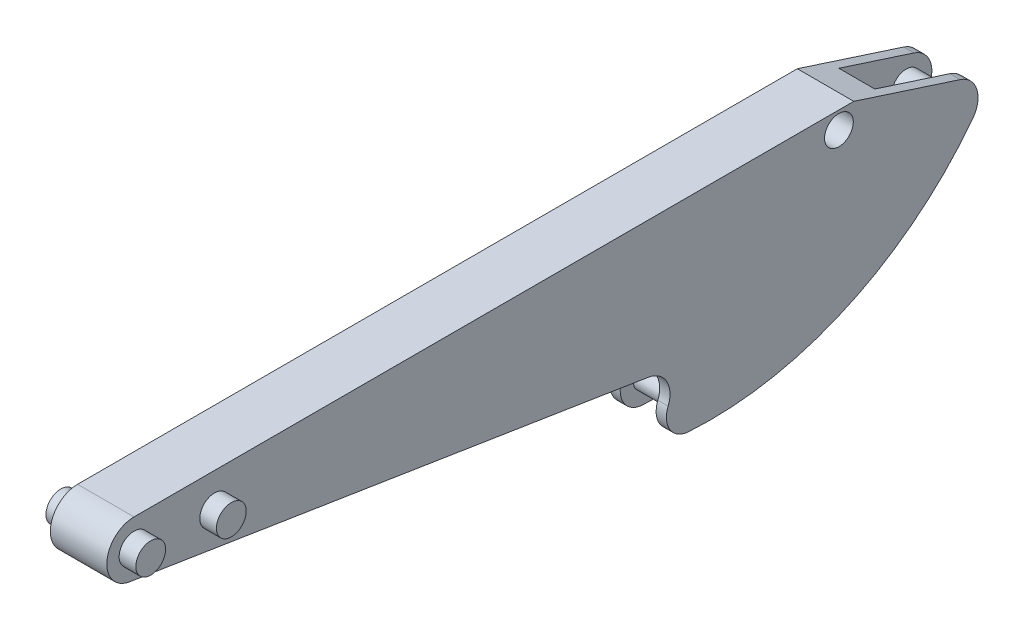
ISO-10303-21;
HEADER;
FILE_DESCRIPTION(('STEP AP214'),'2;1');
FILE_NAME('part.step','',(''),(''),'','','');
FILE_SCHEMA(('AUTOMOTIVE_DESIGN { 1 0 10303 214 1 1 1 1 }'));
ENDSEC;
DATA;
#1=APPLICATION_CONTEXT('core data for automotive mechanical design processes');
#2=APPLICATION_PROTOCOL_DEFINITION('international standard','automotive_design',2000,#1);
#3=PRODUCT_CONTEXT('',#1,'mechanical');
#4=PRODUCT('Part','Part','',(#3));
#5=PRODUCT_RELATED_PRODUCT_CATEGORY('part','',(#4));
#6=PRODUCT_DEFINITION_FORMATION('','',#4);
#7=PRODUCT_DEFINITION_CONTEXT('part definition',#1,'design');
#8=PRODUCT_DEFINITION('design','',#6,#7);
#9=PRODUCT_DEFINITION_SHAPE('','',#8);
#10=(LENGTH_UNIT() NAMED_UNIT(*) SI_UNIT(.MILLI.,.METRE.));
#11=(NAMED_UNIT(*) PLANE_ANGLE_UNIT() SI_UNIT($,.RADIAN.));
#12=(NAMED_UNIT(*) SI_UNIT($,.STERADIAN.) SOLID_ANGLE_UNIT());
#13=UNCERTAINTY_MEASURE_WITH_UNIT(LENGTH_MEASURE(1.E-05),#10,'distance_accuracy_value','');
#14=(GEOMETRIC_REPRESENTATION_CONTEXT(3) GLOBAL_UNCERTAINTY_ASSIGNED_CONTEXT((#13)) GLOBAL_UNIT_ASSIGNED_CONTEXT((#10,
#11,#12)) REPRESENTATION_CONTEXT('',''));
#15=CARTESIAN_POINT('',(0.,0.,0.));
#16=DIRECTION('',(0.,0.,1.));
#17=DIRECTION('',(1.,0.,0.));
#18=AXIS2_PLACEMENT_3D('',#15,#16,#17);
#19=CARTESIAN_POINT('',(55.,297.077101841211,-1123.01138312198));
#20=DIRECTION('',(-1.,0.,0.));
#21=DIRECTION('',(0.,0.,1.));
#22=AXIS2_PLACEMENT_3D('',#19,#20,#21);
#23=CYLINDRICAL_SURFACE('',#22,642.);
#24=DIRECTION('',(-1.,0.,0.));
#25=VECTOR('',#24,1.);
#26=CARTESIAN_POINT('',(55.,-91.8701799258394,-1633.77944399308));
#27=LINE('',#26,#25);
#28=CARTESIAN_POINT('',(-35.,-91.8701799258393,-1633.77944399308));
#29=VERTEX_POINT('',#28);
#30=CARTESIAN_POINT('',(-55.,-91.8701799258394,-1633.77944399308));
#31=VERTEX_POINT('',#30);
#32=EDGE_CURVE('E194',#29,#31,#27,.T.);
#33=ORIENTED_EDGE('',*,*,#32,.F.);
#34=CARTESIAN_POINT('',(-35.,297.077101841211,-1123.01138312198));
#35=DIRECTION('',(1.,0.,0.));
#36=DIRECTION('',(0.,0.,-1.));
#37=AXIS2_PLACEMENT_3D('',#34,#35,#36);
#38=CIRCLE('',#37,642.);
#39=CARTESIAN_POINT('',(-35.,-343.474560585121,-1079.91187311475));
#40=VERTEX_POINT('',#39);
#41=EDGE_CURVE('E319',#29,#40,#38,.F.);
#42=ORIENTED_EDGE('',*,*,#41,.T.);
#43=DIRECTION('',(-1.,0.,0.));
#44=VECTOR('',#43,1.);
#45=CARTESIAN_POINT('',(55.,-343.474560585121,-1079.91187311475));
#46=LINE('',#45,#44);
#47=CARTESIAN_POINT('',(-55.,-343.474560585121,-1079.91187311475));
#48=VERTEX_POINT('',#47);
#49=EDGE_CURVE('E91',#40,#48,#46,.T.);
#50=ORIENTED_EDGE('',*,*,#49,.T.);
#51=CARTESIAN_POINT('',(-55.,297.077101841211,-1123.01138312198));
#52=DIRECTION('',(1.,0.,0.));
#53=DIRECTION('',(0.,0.,-1.));
#54=AXIS2_PLACEMENT_3D('',#51,#52,#53);
#55=CIRCLE('',#54,642.);
#56=EDGE_CURVE('E154',#31,#48,#55,.F.);
#57=ORIENTED_EDGE('',*,*,#56,.F.);
#58=EDGE_LOOP('',(#33,#42,#50,#57));
#59=FACE_BOUND('',#58,.T.);
#60=ADVANCED_FACE('F33',(#59),#23,.T.);
#61=CARTESIAN_POINT('',(55.,-61.5783355514582,-1594.));
#62=DIRECTION('',(-1.,0.,0.));
#63=DIRECTION('',(0.,0.,1.));
#64=AXIS2_PLACEMENT_3D('',#61,#62,#63);
#65=CYLINDRICAL_SURFACE('',#64,50.0000000000005);
#66=DIRECTION('',(-1.,0.,0.));
#67=VECTOR('',#66,1.);
#68=CARTESIAN_POINT('',(55.,-13.9999999999999,-1609.3721171656));
#69=LINE('',#68,#67);
#70=CARTESIAN_POINT('',(-35.,-13.9999999999999,-1609.3721171656));
#71=VERTEX_POINT('',#70);
#72=CARTESIAN_POINT('',(-55.,-13.9999999999999,-1609.3721171656));
#73=VERTEX_POINT('',#72);
#74=EDGE_CURVE('E190',#71,#73,#69,.T.);
#75=ORIENTED_EDGE('',*,*,#74,.F.);
#76=CARTESIAN_POINT('',(-35.,-61.5783355514582,-1594.));
#77=DIRECTION('',(1.,0.,0.));
#78=DIRECTION('',(0.,0.,-1.));
#79=AXIS2_PLACEMENT_3D('',#76,#77,#78);
#80=CIRCLE('',#79,50.0000000000004);
#81=EDGE_CURVE('E346',#29,#71,#80,.T.);
#82=ORIENTED_EDGE('',*,*,#81,.F.);
#83=ORIENTED_EDGE('',*,*,#32,.T.);
#84=CARTESIAN_POINT('',(-55.,-61.5783355514582,-1594.));
#85=DIRECTION('',(1.,0.,0.));
#86=DIRECTION('',(0.,0.,-1.));
#87=AXIS2_PLACEMENT_3D('',#84,#85,#86);
#88=CIRCLE('',#87,50.0000000000005);
#89=EDGE_CURVE('E157',#73,#31,#88,.F.);
#90=ORIENTED_EDGE('',*,*,#89,.F.);
#91=EDGE_LOOP('',(#75,#82,#83,#90));
#92=FACE_BOUND('',#91,.T.);
#93=ADVANCED_FACE('F231',(#92),#65,.T.);
#94=CARTESIAN_POINT('',(55.,458.148160931514,-148.023404505723));
#95=DIRECTION('',(0.,0.951566711029159,-0.307442343311959));
#96=DIRECTION('',(0.,0.307442343311959,0.951566711029159));
#97=AXIS2_PLACEMENT_3D('',#94,#95,#96);
#98=PLANE('',#97);
#99=DIRECTION('',(1.,0.,0.));
#100=VECTOR('',#99,1.);
#101=CARTESIAN_POINT('',(-35.,33.3236900280346,-1462.90026950587));
#102=LINE('',#101,#100);
#103=CARTESIAN_POINT('',(-35.,33.3236900280346,-1462.90026950587));
#104=VERTEX_POINT('',#103);
#105=CARTESIAN_POINT('',(35.,33.3236900280346,-1462.90026950587));
#106=VERTEX_POINT('',#105);
#107=EDGE_CURVE('E300',#104,#106,#102,.T.);
#108=ORIENTED_EDGE('',*,*,#107,.F.);
#109=DIRECTION('',(0.,-0.307442343311959,-0.951566711029159));
#110=VECTOR('',#109,1.);
#111=CARTESIAN_POINT('',(-35.,458.148160931514,-148.023404505723));
#112=LINE('',#111,#110);
#113=EDGE_CURVE('E348',#104,#71,#112,.T.);
#114=ORIENTED_EDGE('',*,*,#113,.T.);
#115=ORIENTED_EDGE('',*,*,#74,.T.);
#116=DIRECTION('',(0.,-0.307442343311959,-0.951566711029159));
#117=VECTOR('',#116,1.);
#118=CARTESIAN_POINT('',(-55.,458.148160931514,-148.023404505723));
#119=LINE('',#118,#117);
#120=CARTESIAN_POINT('',(-55.,53.,-1402.));
#121=VERTEX_POINT('',#120);
#122=EDGE_CURVE('E161',#121,#73,#119,.T.);
#123=ORIENTED_EDGE('',*,*,#122,.F.);
#124=DIRECTION('',(-1.,0.,0.));
#125=VECTOR('',#124,1.);
#126=CARTESIAN_POINT('',(55.,53.,-1402.));
#127=LINE('',#126,#125);
#128=CARTESIAN_POINT('',(55.,53.,-1402.));
#129=VERTEX_POINT('',#128);
#130=EDGE_CURVE('E188',#129,#121,#127,.T.);
#131=ORIENTED_EDGE('',*,*,#130,.F.);
#132=DIRECTION('',(0.,-0.307442343311959,-0.951566711029159));
#133=VECTOR('',#132,1.);
#134=CARTESIAN_POINT('',(55.,458.148160931514,-148.023404505723));
#135=LINE('',#134,#133);
#136=CARTESIAN_POINT('',(55.,-13.9999999999999,-1609.3721171656));
#137=VERTEX_POINT('',#136);
#138=EDGE_CURVE('E260',#129,#137,#135,.T.);
#139=ORIENTED_EDGE('',*,*,#138,.T.);
#140=CARTESIAN_POINT('',(35.,-13.9999999999999,-1609.3721171656));
#141=VERTEX_POINT('',#140);
#142=EDGE_CURVE('E191',#137,#141,#69,.T.);
#143=ORIENTED_EDGE('',*,*,#142,.T.);
#144=DIRECTION('',(0.,-0.307442343311959,-0.951566711029159));
#145=VECTOR('',#144,1.);
#146=CARTESIAN_POINT('',(35.,458.148160931514,-148.023404505723));
#147=LINE('',#146,#145);
#148=EDGE_CURVE('E307',#106,#141,#147,.T.);
#149=ORIENTED_EDGE('',*,*,#148,.F.);
#150=EDGE_LOOP('',(#108,#114,#115,#123,#131,#139,#143,#149));
#151=FACE_BOUND('',#150,.T.);
#152=ADVANCED_FACE('F235',(#151),#98,.T.);
#153=CARTESIAN_POINT('',(55.,-261.710482902588,-993.952276018087));
#154=DIRECTION('',(-1.,0.,0.));
#155=DIRECTION('',(0.,0.,1.));
#156=AXIS2_PLACEMENT_3D('',#153,#154,#155);
#157=CYLINDRICAL_SURFACE('',#156,50.);
#158=CARTESIAN_POINT('',(-35.,-261.710482902588,-993.952276018087));
#159=DIRECTION('',(1.,0.,0.));
#160=DIRECTION('',(0.,0.,-1.));
#161=AXIS2_PLACEMENT_3D('',#158,#159,#160);
#162=CIRCLE('',#161,50.);
#163=CARTESIAN_POINT('',(-35.,-280.391656157208,-1040.33129892533));
#164=VERTEX_POINT('',#163);
#165=CARTESIAN_POINT('',(-35.,-212.326065872832,-1001.7739992701));
#166=VERTEX_POINT('',#165);
#167=EDGE_CURVE('E290',#164,#166,#162,.T.);
#168=ORIENTED_EDGE('',*,*,#167,.T.);
#169=DIRECTION('',(-1.,0.,0.));
#170=VECTOR('',#169,1.);
#171=CARTESIAN_POINT('',(55.,-212.326065872832,-1001.7739992701));
#172=LINE('',#171,#170);
#173=CARTESIAN_POINT('',(-55.,-212.326065872832,-1001.7739992701));
#174=VERTEX_POINT('',#173);
#175=EDGE_CURVE('E142',#166,#174,#172,.T.);
#176=ORIENTED_EDGE('',*,*,#175,.T.);
#177=CARTESIAN_POINT('',(-55.,-261.710482902588,-993.952276018087));
#178=DIRECTION('',(1.,0.,0.));
#179=DIRECTION('',(0.,0.,-1.));
#180=AXIS2_PLACEMENT_3D('',#177,#178,#179);
#181=CIRCLE('',#180,50.);
#182=CARTESIAN_POINT('',(-55.,-280.391656157208,-1040.33129892533));
#183=VERTEX_POINT('',#182);
#184=EDGE_CURVE('E171',#174,#183,#181,.F.);
#185=ORIENTED_EDGE('',*,*,#184,.T.);
#186=DIRECTION('',(-1.,0.,0.));
#187=VECTOR('',#186,1.);
#188=CARTESIAN_POINT('',(55.,-280.391656157208,-1040.33129892533));
#189=LINE('',#188,#187);
#190=EDGE_CURVE('E183',#164,#183,#189,.T.);
#191=ORIENTED_EDGE('',*,*,#190,.F.);
#192=EDGE_LOOP('',(#168,#176,#185,#191));
#193=FACE_BOUND('',#192,.T.);
#194=ADVANCED_FACE('F246',(#193),#157,.F.);
#195=CARTESIAN_POINT('',(55.,-297.578335551458,-1083.));
#196=DIRECTION('',(-1.,0.,0.));
#197=DIRECTION('',(0.,0.,1.));
#198=AXIS2_PLACEMENT_3D('',#195,#196,#197);
#199=CYLINDRICAL_SURFACE('',#198,46.0000000000001);
#200=CARTESIAN_POINT('',(-35.,-297.578335551458,-1083.));
#201=DIRECTION('',(1.,0.,0.));
#202=DIRECTION('',(0.,0.,-1.));
#203=AXIS2_PLACEMENT_3D('',#200,#201,#202);
#204=CIRCLE('',#203,46.0000000000001);
#205=EDGE_CURVE('E297',#164,#40,#204,.T.);
#206=ORIENTED_EDGE('',*,*,#205,.F.);
#207=ORIENTED_EDGE('',*,*,#190,.T.);
#208=CARTESIAN_POINT('',(-55.,-297.578335551458,-1083.));
#209=DIRECTION('',(1.,0.,0.));
#210=DIRECTION('',(0.,0.,-1.));
#211=AXIS2_PLACEMENT_3D('',#208,#209,#210);
#212=CIRCLE('',#211,46.0000000000001);
#213=EDGE_CURVE('E174',#183,#48,#212,.T.);
#214=ORIENTED_EDGE('',*,*,#213,.T.);
#215=ORIENTED_EDGE('',*,*,#49,.F.);
#216=EDGE_LOOP('',(#206,#207,#214,#215));
#217=FACE_BOUND('',#216,.T.);
#218=ADVANCED_FACE('F229',(#217),#199,.T.);
#219=CARTESIAN_POINT('',(35.,297.077101841211,-1123.01138312198));
#220=DIRECTION('',(1.,0.,0.));
#221=DIRECTION('',(0.,0.,-1.));
#222=AXIS2_PLACEMENT_3D('',#219,#220,#221);
#223=CIRCLE('',#222,642.);
#224=CARTESIAN_POINT('',(35.,-91.8701799258393,-1633.77944399308));
#225=VERTEX_POINT('',#224);
#226=CARTESIAN_POINT('',(35.,-343.474560585121,-1079.91187311475));
#227=VERTEX_POINT('',#226);
#228=EDGE_CURVE('E48',#225,#227,#223,.F.);
#229=ORIENTED_EDGE('',*,*,#228,.F.);
#230=CARTESIAN_POINT('',(55.,-91.8701799258394,-1633.77944399308));
#231=VERTEX_POINT('',#230);
#232=EDGE_CURVE('E99',#231,#225,#27,.T.);
#233=ORIENTED_EDGE('',*,*,#232,.F.);
#234=CARTESIAN_POINT('',(55.,297.077101841211,-1123.01138312198));
#235=DIRECTION('',(1.,0.,0.));
#236=DIRECTION('',(0.,0.,-1.));
#237=AXIS2_PLACEMENT_3D('',#234,#235,#236);
#238=CIRCLE('',#237,642.);
#239=CARTESIAN_POINT('',(55.,-343.474560585121,-1079.91187311475));
#240=VERTEX_POINT('',#239);
#241=EDGE_CURVE('E179',#231,#240,#238,.F.);
#242=ORIENTED_EDGE('',*,*,#241,.T.);
#243=EDGE_CURVE('E180',#240,#227,#46,.T.);
#244=ORIENTED_EDGE('',*,*,#243,.T.);
#245=EDGE_LOOP('',(#229,#233,#242,#244));
#246=FACE_BOUND('',#245,.T.);
#247=ADVANCED_FACE('F35',(#246),#23,.T.);
#248=CARTESIAN_POINT('',(35.,-61.5783355514582,-1594.));
#249=DIRECTION('',(1.,0.,0.));
#250=DIRECTION('',(0.,0.,-1.));
#251=AXIS2_PLACEMENT_3D('',#248,#249,#250);
#252=CIRCLE('',#251,50.0000000000004);
#253=EDGE_CURVE('E251',#225,#141,#252,.T.);
#254=ORIENTED_EDGE('',*,*,#253,.T.);
#255=ORIENTED_EDGE('',*,*,#142,.F.);
#256=CARTESIAN_POINT('',(55.,-61.5783355514582,-1594.));
#257=DIRECTION('',(1.,0.,0.));
#258=DIRECTION('',(0.,0.,-1.));
#259=AXIS2_PLACEMENT_3D('',#256,#257,#258);
#260=CIRCLE('',#259,50.0000000000005);
#261=EDGE_CURVE('E257',#137,#231,#260,.F.);
#262=ORIENTED_EDGE('',*,*,#261,.T.);
#263=ORIENTED_EDGE('',*,*,#232,.T.);
#264=EDGE_LOOP('',(#254,#255,#262,#263));
#265=FACE_BOUND('',#264,.T.);
#266=ADVANCED_FACE('F237',(#265),#65,.T.);
#267=CARTESIAN_POINT('',(55.,53.,0.));
#268=DIRECTION('',(0.,1.,0.));
#269=DIRECTION('',(0.,0.,1.));
#270=AXIS2_PLACEMENT_3D('',#267,#268,#269);
#271=PLANE('',#270);
#272=DIRECTION('',(0.,0.,-1.));
#273=VECTOR('',#272,1.);
#274=CARTESIAN_POINT('',(-55.,53.,0.));
#275=LINE('',#274,#273);
#276=CARTESIAN_POINT('',(-55.,53.,0.));
#277=VERTEX_POINT('',#276);
#278=EDGE_CURVE('E164',#277,#121,#275,.T.);
#279=ORIENTED_EDGE('',*,*,#278,.F.);
#280=DIRECTION('',(-1.,0.,0.));
#281=VECTOR('',#280,1.);
#282=CARTESIAN_POINT('',(55.,53.,0.));
#283=LINE('',#282,#281);
#284=CARTESIAN_POINT('',(55.,53.,0.));
#285=VERTEX_POINT('',#284);
#286=EDGE_CURVE('E186',#285,#277,#283,.T.);
#287=ORIENTED_EDGE('',*,*,#286,.F.);
#288=DIRECTION('',(0.,0.,-1.));
#289=VECTOR('',#288,1.);
#290=CARTESIAN_POINT('',(55.,53.,0.));
#291=LINE('',#290,#289);
#292=EDGE_CURVE('E262',#285,#129,#291,.T.);
#293=ORIENTED_EDGE('',*,*,#292,.T.);
#294=ORIENTED_EDGE('',*,*,#130,.T.);
#295=EDGE_LOOP('',(#279,#287,#293,#294));
#296=FACE_BOUND('',#295,.T.);
#297=ADVANCED_FACE('F244',(#296),#271,.T.);
#298=CARTESIAN_POINT('',(55.,0.,0.));
#299=DIRECTION('',(-1.,0.,0.));
#300=DIRECTION('',(0.,0.,1.));
#301=AXIS2_PLACEMENT_3D('',#298,#299,#300);
#302=CYLINDRICAL_SURFACE('',#301,53.);
#303=CARTESIAN_POINT('',(-55.,0.,0.));
#304=DIRECTION('',(1.,0.,0.));
#305=DIRECTION('',(0.,0.,-1.));
#306=AXIS2_PLACEMENT_3D('',#303,#304,#305);
#307=CIRCLE('',#306,53.);
#308=CARTESIAN_POINT('',(-55.,-52.3474820515423,8.29102664713225));
#309=VERTEX_POINT('',#308);
#310=EDGE_CURVE('E167',#277,#309,#307,.T.);
#311=ORIENTED_EDGE('',*,*,#310,.T.);
#312=DIRECTION('',(-1.,0.,0.));
#313=VECTOR('',#312,1.);
#314=CARTESIAN_POINT('',(55.,-52.3474820515423,8.29102664713225));
#315=LINE('',#314,#313);
#316=CARTESIAN_POINT('',(55.,-52.3474820515423,8.29102664713225));
#317=VERTEX_POINT('',#316);
#318=EDGE_CURVE('E141',#317,#309,#315,.T.);
#319=ORIENTED_EDGE('',*,*,#318,.F.);
#320=CARTESIAN_POINT('',(55.,0.,0.));
#321=DIRECTION('',(1.,0.,0.));
#322=DIRECTION('',(0.,0.,-1.));
#323=AXIS2_PLACEMENT_3D('',#320,#321,#322);
#324=CIRCLE('',#323,53.);
#325=EDGE_CURVE('E125',#285,#317,#324,.T.);
#326=ORIENTED_EDGE('',*,*,#325,.F.);
#327=ORIENTED_EDGE('',*,*,#286,.T.);
#328=EDGE_LOOP('',(#311,#319,#326,#327));
#329=FACE_BOUND('',#328,.T.);
#330=ADVANCED_FACE('F281',(#329),#302,.T.);
#331=CARTESIAN_POINT('',(55.,-52.3474820515423,8.29102664713225));
#332=DIRECTION('',(0.,0.987688340595138,-0.156434465040231));
#333=DIRECTION('',(0.,0.156434465040231,0.987688340595138));
#334=AXIS2_PLACEMENT_3D('',#331,#332,#333);
#335=PLANE('',#334);
#336=DIRECTION('',(0.,-0.156434465040231,-0.987688340595138));
#337=VECTOR('',#336,1.);
#338=CARTESIAN_POINT('',(-55.,-52.3474820515423,8.29102664713225));
#339=LINE('',#338,#337);
#340=EDGE_CURVE('E169',#309,#174,#339,.T.);
#341=ORIENTED_EDGE('',*,*,#340,.T.);
#342=ORIENTED_EDGE('',*,*,#175,.F.);
#343=DIRECTION('',(0.,-0.156434465040231,-0.987688340595138));
#344=VECTOR('',#343,1.);
#345=CARTESIAN_POINT('',(-35.,-52.3474820515427,8.29102664713229));
#346=LINE('',#345,#344);
#347=CARTESIAN_POINT('',(-35.,-251.544855986975,-1249.39169475699));
#348=VERTEX_POINT('',#347);
#349=EDGE_CURVE('E298',#166,#348,#346,.T.);
#350=ORIENTED_EDGE('',*,*,#349,.T.);
#351=DIRECTION('',(1.,0.,0.));
#352=VECTOR('',#351,1.);
#353=CARTESIAN_POINT('',(-35.,-251.544855986975,-1249.39169475699));
#354=LINE('',#353,#352);
#355=CARTESIAN_POINT('',(35.,-251.544855986975,-1249.39169475699));
#356=VERTEX_POINT('',#355);
#357=EDGE_CURVE('E158',#348,#356,#354,.T.);
#358=ORIENTED_EDGE('',*,*,#357,.T.);
#359=DIRECTION('',(0.,-0.156434465040231,-0.987688340595138));
#360=VECTOR('',#359,1.);
#361=CARTESIAN_POINT('',(35.,-52.3474820515427,8.29102664713229));
#362=LINE('',#361,#360);
#363=CARTESIAN_POINT('',(35.,-212.326065872832,-1001.7739992701));
#364=VERTEX_POINT('',#363);
#365=EDGE_CURVE('E138',#364,#356,#362,.T.);
#366=ORIENTED_EDGE('',*,*,#365,.F.);
#367=CARTESIAN_POINT('',(55.,-212.326065872832,-1001.7739992701));
#368=VERTEX_POINT('',#367);
#369=EDGE_CURVE('E132',#368,#364,#172,.T.);
#370=ORIENTED_EDGE('',*,*,#369,.F.);
#371=DIRECTION('',(0.,-0.156434465040231,-0.987688340595138));
#372=VECTOR('',#371,1.);
#373=CARTESIAN_POINT('',(55.,-52.3474820515423,8.29102664713225));
#374=LINE('',#373,#372);
#375=EDGE_CURVE('E116',#317,#368,#374,.T.);
#376=ORIENTED_EDGE('',*,*,#375,.F.);
#377=ORIENTED_EDGE('',*,*,#318,.T.);
#378=EDGE_LOOP('',(#341,#342,#350,#358,#366,#370,#376,#377));
#379=FACE_BOUND('',#378,.T.);
#380=ADVANCED_FACE('F134',(#379),#335,.F.);
#381=ORIENTED_EDGE('',*,*,#369,.T.);
#382=CARTESIAN_POINT('',(35.,-261.710482902588,-993.952276018087));
#383=DIRECTION('',(1.,0.,0.));
#384=DIRECTION('',(0.,0.,-1.));
#385=AXIS2_PLACEMENT_3D('',#382,#383,#384);
#386=CIRCLE('',#385,50.);
#387=CARTESIAN_POINT('',(35.,-280.391656157208,-1040.33129892533));
#388=VERTEX_POINT('',#387);
#389=EDGE_CURVE('E314',#388,#364,#386,.T.);
#390=ORIENTED_EDGE('',*,*,#389,.F.);
#391=CARTESIAN_POINT('',(55.,-280.391656157208,-1040.33129892533));
#392=VERTEX_POINT('',#391);
#393=EDGE_CURVE('E146',#392,#388,#189,.T.);
#394=ORIENTED_EDGE('',*,*,#393,.F.);
#395=CARTESIAN_POINT('',(55.,-261.710482902588,-993.952276018087));
#396=DIRECTION('',(1.,0.,0.));
#397=DIRECTION('',(0.,0.,-1.));
#398=AXIS2_PLACEMENT_3D('',#395,#396,#397);
#399=CIRCLE('',#398,50.);
#400=EDGE_CURVE('E121',#368,#392,#399,.F.);
#401=ORIENTED_EDGE('',*,*,#400,.F.);
#402=EDGE_LOOP('',(#381,#390,#394,#401));
#403=FACE_BOUND('',#402,.T.);
#404=ADVANCED_FACE('F144',(#403),#157,.F.);
#405=ORIENTED_EDGE('',*,*,#393,.T.);
#406=CARTESIAN_POINT('',(35.,-297.578335551458,-1083.));
#407=DIRECTION('',(1.,0.,0.));
#408=DIRECTION('',(0.,0.,-1.));
#409=AXIS2_PLACEMENT_3D('',#406,#407,#408);
#410=CIRCLE('',#409,46.0000000000001);
#411=EDGE_CURVE('E317',#388,#227,#410,.T.);
#412=ORIENTED_EDGE('',*,*,#411,.T.);
#413=ORIENTED_EDGE('',*,*,#243,.F.);
#414=CARTESIAN_POINT('',(55.,-297.578335551458,-1083.));
#415=DIRECTION('',(1.,0.,0.));
#416=DIRECTION('',(0.,0.,-1.));
#417=AXIS2_PLACEMENT_3D('',#414,#415,#416);
#418=CIRCLE('',#417,46.0000000000001);
#419=EDGE_CURVE('E57',#392,#240,#418,.T.);
#420=ORIENTED_EDGE('',*,*,#419,.F.);
#421=EDGE_LOOP('',(#405,#412,#413,#420));
#422=FACE_BOUND('',#421,.T.);
#423=ADVANCED_FACE('F218',(#422),#199,.T.);
#424=CARTESIAN_POINT('',(55.,19.,-1373.));
#425=DIRECTION('',(-1.,0.,0.));
#426=DIRECTION('',(0.,0.,1.));
#427=AXIS2_PLACEMENT_3D('',#424,#425,#426);
#428=CYLINDRICAL_SURFACE('',#427,28.);
#429=CARTESIAN_POINT('',(55.,19.,-1373.));
#430=DIRECTION('',(1.,0.,0.));
#431=DIRECTION('',(0.,0.,-1.));
#432=AXIS2_PLACEMENT_3D('',#429,#430,#431);
#433=CIRCLE('',#432,28.);
#434=CARTESIAN_POINT('',(55.,19.,-1401.));
#435=VERTEX_POINT('',#434);
#436=EDGE_CURVE('E148',#435,#435,#433,.T.);
#437=ORIENTED_EDGE('',*,*,#436,.T.);
#438=EDGE_LOOP('',(#437));
#439=FACE_BOUND('',#438,.T.);
#440=CARTESIAN_POINT('',(-55.,19.,-1373.));
#441=DIRECTION('',(1.,0.,0.));
#442=DIRECTION('',(0.,0.,-1.));
#443=AXIS2_PLACEMENT_3D('',#440,#441,#442);
#444=CIRCLE('',#443,28.);
#445=CARTESIAN_POINT('',(-55.,19.,-1401.));
#446=VERTEX_POINT('',#445);
#447=EDGE_CURVE('E176',#446,#446,#444,.T.);
#448=ORIENTED_EDGE('',*,*,#447,.F.);
#449=EDGE_LOOP('',(#448));
#450=FACE_BOUND('',#449,.T.);
#451=ADVANCED_FACE('F216',(#439,#450),#428,.F.);
#452=CARTESIAN_POINT('',(55.,0.,0.));
#453=DIRECTION('',(1.,0.,0.));
#454=DIRECTION('',(0.,0.,-1.));
#455=AXIS2_PLACEMENT_3D('',#452,#453,#454);
#456=PLANE('',#455);
#457=CARTESIAN_POINT('',(55.,-14.,-157.));
#458=DIRECTION('',(1.,0.,0.));
#459=DIRECTION('',(0.,0.,-1.));
#460=AXIS2_PLACEMENT_3D('',#457,#458,#459);
#461=CIRCLE('',#460,29.);
#462=CARTESIAN_POINT('',(55.,-14.,-186.));
#463=VERTEX_POINT('',#462);
#464=EDGE_CURVE('E364',#463,#463,#461,.F.);
#465=ORIENTED_EDGE('',*,*,#464,.T.);
#466=EDGE_LOOP('',(#465));
#467=FACE_BOUND('',#466,.T.);
#468=CARTESIAN_POINT('',(55.,0.,0.));
#469=DIRECTION('',(1.,0.,0.));
#470=DIRECTION('',(0.,0.,-1.));
#471=AXIS2_PLACEMENT_3D('',#468,#469,#470);
#472=CIRCLE('',#471,29.);
#473=CARTESIAN_POINT('',(55.,0.,-29.));
#474=VERTEX_POINT('',#473);
#475=EDGE_CURVE('E357',#474,#474,#472,.F.);
#476=ORIENTED_EDGE('',*,*,#475,.T.);
#477=EDGE_LOOP('',(#476));
#478=FACE_BOUND('',#477,.T.);
#479=ORIENTED_EDGE('',*,*,#241,.F.);
#480=ORIENTED_EDGE('',*,*,#261,.F.);
#481=ORIENTED_EDGE('',*,*,#138,.F.);
#482=ORIENTED_EDGE('',*,*,#292,.F.);
#483=ORIENTED_EDGE('',*,*,#325,.T.);
#484=ORIENTED_EDGE('',*,*,#375,.T.);
#485=ORIENTED_EDGE('',*,*,#400,.T.);
#486=ORIENTED_EDGE('',*,*,#419,.T.);
#487=EDGE_LOOP('',(#479,#480,#481,#482,#483,#484,#485,#486));
#488=FACE_BOUND('',#487,.T.);
#489=ORIENTED_EDGE('',*,*,#436,.F.);
#490=EDGE_LOOP('',(#489));
#491=FACE_BOUND('',#490,.T.);
#492=ADVANCED_FACE('F118',(#467,#478,#488,#491),#456,.T.);
#493=CARTESIAN_POINT('',(-55.,0.,0.));
#494=DIRECTION('',(1.,0.,0.));
#495=DIRECTION('',(0.,0.,-1.));
#496=AXIS2_PLACEMENT_3D('',#493,#494,#495);
#497=PLANE('',#496);
#498=CARTESIAN_POINT('',(-55.,-14.,-157.));
#499=DIRECTION('',(1.,0.,0.));
#500=DIRECTION('',(0.,0.,-1.));
#501=AXIS2_PLACEMENT_3D('',#498,#499,#500);
#502=CIRCLE('',#501,29.);
#503=CARTESIAN_POINT('',(-55.,-14.,-186.));
#504=VERTEX_POINT('',#503);
#505=EDGE_CURVE('E12',#504,#504,#502,.F.);
#506=ORIENTED_EDGE('',*,*,#505,.F.);
#507=EDGE_LOOP('',(#506));
#508=FACE_BOUND('',#507,.T.);
#509=CARTESIAN_POINT('',(-55.,0.,0.));
#510=DIRECTION('',(1.,0.,0.));
#511=DIRECTION('',(0.,0.,-1.));
#512=AXIS2_PLACEMENT_3D('',#509,#510,#511);
#513=CIRCLE('',#512,29.);
#514=CARTESIAN_POINT('',(-55.,0.,-29.));
#515=VERTEX_POINT('',#514);
#516=EDGE_CURVE('E41',#515,#515,#513,.F.);
#517=ORIENTED_EDGE('',*,*,#516,.F.);
#518=EDGE_LOOP('',(#517));
#519=FACE_BOUND('',#518,.T.);
#520=ORIENTED_EDGE('',*,*,#56,.T.);
#521=ORIENTED_EDGE('',*,*,#213,.F.);
#522=ORIENTED_EDGE('',*,*,#184,.F.);
#523=ORIENTED_EDGE('',*,*,#340,.F.);
#524=ORIENTED_EDGE('',*,*,#310,.F.);
#525=ORIENTED_EDGE('',*,*,#278,.T.);
#526=ORIENTED_EDGE('',*,*,#122,.T.);
#527=ORIENTED_EDGE('',*,*,#89,.T.);
#528=EDGE_LOOP('',(#520,#521,#522,#523,#524,#525,#526,#527));
#529=FACE_BOUND('',#528,.T.);
#530=ORIENTED_EDGE('',*,*,#447,.T.);
#531=EDGE_LOOP('',(#530));
#532=FACE_BOUND('',#531,.T.);
#533=ADVANCED_FACE('F206',(#508,#519,#529,#532),#497,.F.);
#534=CARTESIAN_POINT('',(-35.,-690.074247548855,-920.714532298584));
#535=DIRECTION('',(0.,-0.599743187496829,-0.800192544985982));
#536=DIRECTION('',(0.,0.800192544985982,-0.599743187496829));
#537=AXIS2_PLACEMENT_3D('',#534,#535,#536);
#538=PLANE('',#537);
#539=DIRECTION('',(0.,0.800192544985982,-0.599743187496829));
#540=VECTOR('',#539,1.);
#541=CARTESIAN_POINT('',(35.,-690.074247548855,-920.714532298584));
#542=LINE('',#541,#540);
#543=EDGE_CURVE('E310',#356,#106,#542,.T.);
#544=ORIENTED_EDGE('',*,*,#543,.F.);
#545=ORIENTED_EDGE('',*,*,#357,.F.);
#546=DIRECTION('',(0.,0.800192544985982,-0.599743187496829));
#547=VECTOR('',#546,1.);
#548=CARTESIAN_POINT('',(-35.,-690.074247548855,-920.714532298584));
#549=LINE('',#548,#547);
#550=EDGE_CURVE('E302',#348,#104,#549,.T.);
#551=ORIENTED_EDGE('',*,*,#550,.T.);
#552=ORIENTED_EDGE('',*,*,#107,.T.);
#553=EDGE_LOOP('',(#544,#545,#551,#552));
#554=FACE_BOUND('',#553,.T.);
#555=ADVANCED_FACE('F209',(#554),#538,.T.);
#556=CARTESIAN_POINT('',(-35.,0.,0.));
#557=DIRECTION('',(1.,0.,0.));
#558=DIRECTION('',(0.,0.,-1.));
#559=AXIS2_PLACEMENT_3D('',#556,#557,#558);
#560=PLANE('',#559);
#561=CARTESIAN_POINT('',(-35.,-297.578335551458,-1083.));
#562=DIRECTION('',(1.,0.,0.));
#563=DIRECTION('',(0.,0.,-1.));
#564=AXIS2_PLACEMENT_3D('',#561,#562,#563);
#565=CIRCLE('',#564,20.);
#566=CARTESIAN_POINT('',(-35.,-297.578335551458,-1103.));
#567=VERTEX_POINT('',#566);
#568=EDGE_CURVE('E354',#567,#567,#565,.T.);
#569=ORIENTED_EDGE('',*,*,#568,.F.);
#570=EDGE_LOOP('',(#569));
#571=FACE_BOUND('',#570,.T.);
#572=CARTESIAN_POINT('',(-35.,-61.5783355514582,-1594.));
#573=DIRECTION('',(1.,0.,0.));
#574=DIRECTION('',(0.,0.,-1.));
#575=AXIS2_PLACEMENT_3D('',#572,#573,#574);
#576=CIRCLE('',#575,28.);
#577=CARTESIAN_POINT('',(-35.,-61.5783355514582,-1622.));
#578=VERTEX_POINT('',#577);
#579=EDGE_CURVE('E252',#578,#578,#576,.T.);
#580=ORIENTED_EDGE('',*,*,#579,.F.);
#581=EDGE_LOOP('',(#580));
#582=FACE_BOUND('',#581,.T.);
#583=ORIENTED_EDGE('',*,*,#41,.F.);
#584=ORIENTED_EDGE('',*,*,#81,.T.);
#585=ORIENTED_EDGE('',*,*,#113,.F.);
#586=ORIENTED_EDGE('',*,*,#550,.F.);
#587=ORIENTED_EDGE('',*,*,#349,.F.);
#588=ORIENTED_EDGE('',*,*,#167,.F.);
#589=ORIENTED_EDGE('',*,*,#205,.T.);
#590=EDGE_LOOP('',(#583,#584,#585,#586,#587,#588,#589));
#591=FACE_BOUND('',#590,.T.);
#592=ADVANCED_FACE('F345',(#571,#582,#591),#560,.T.);
#593=CARTESIAN_POINT('',(35.,0.,0.));
#594=DIRECTION('',(1.,0.,0.));
#595=DIRECTION('',(0.,0.,-1.));
#596=AXIS2_PLACEMENT_3D('',#593,#594,#595);
#597=PLANE('',#596);
#598=CARTESIAN_POINT('',(35.,-297.578335551458,-1083.));
#599=DIRECTION('',(1.,0.,0.));
#600=DIRECTION('',(0.,0.,-1.));
#601=AXIS2_PLACEMENT_3D('',#598,#599,#600);
#602=CIRCLE('',#601,20.);
#603=CARTESIAN_POINT('',(35.,-297.578335551458,-1103.));
#604=VERTEX_POINT('',#603);
#605=EDGE_CURVE('E199',#604,#604,#602,.F.);
#606=ORIENTED_EDGE('',*,*,#605,.F.);
#607=EDGE_LOOP('',(#606));
#608=FACE_BOUND('',#607,.T.);
#609=CARTESIAN_POINT('',(35.,-61.5783355514582,-1594.));
#610=DIRECTION('',(1.,0.,0.));
#611=DIRECTION('',(0.,0.,-1.));
#612=AXIS2_PLACEMENT_3D('',#609,#610,#611);
#613=CIRCLE('',#612,28.);
#614=CARTESIAN_POINT('',(35.,-61.5783355514582,-1622.));
#615=VERTEX_POINT('',#614);
#616=EDGE_CURVE('E196',#615,#615,#613,.F.);
#617=ORIENTED_EDGE('',*,*,#616,.F.);
#618=EDGE_LOOP('',(#617));
#619=FACE_BOUND('',#618,.T.);
#620=ORIENTED_EDGE('',*,*,#228,.T.);
#621=ORIENTED_EDGE('',*,*,#411,.F.);
#622=ORIENTED_EDGE('',*,*,#389,.T.);
#623=ORIENTED_EDGE('',*,*,#365,.T.);
#624=ORIENTED_EDGE('',*,*,#543,.T.);
#625=ORIENTED_EDGE('',*,*,#148,.T.);
#626=ORIENTED_EDGE('',*,*,#253,.F.);
#627=EDGE_LOOP('',(#620,#621,#622,#623,#624,#625,#626));
#628=FACE_BOUND('',#627,.T.);
#629=ADVANCED_FACE('F331',(#608,#619,#628),#597,.F.);
#630=CARTESIAN_POINT('',(35.,-61.5783355514582,-1594.));
#631=DIRECTION('',(-1.,0.,0.));
#632=DIRECTION('',(0.,0.,1.));
#633=AXIS2_PLACEMENT_3D('',#630,#631,#632);
#634=CYLINDRICAL_SURFACE('',#633,28.);
#635=ORIENTED_EDGE('',*,*,#616,.T.);
#636=EDGE_LOOP('',(#635));
#637=FACE_BOUND('',#636,.T.);
#638=ORIENTED_EDGE('',*,*,#579,.T.);
#639=EDGE_LOOP('',(#638));
#640=FACE_BOUND('',#639,.T.);
#641=ADVANCED_FACE('F408',(#637,#640),#634,.T.);
#642=CARTESIAN_POINT('',(35.,-297.578335551458,-1083.));
#643=DIRECTION('',(-1.,0.,0.));
#644=DIRECTION('',(0.,0.,1.));
#645=AXIS2_PLACEMENT_3D('',#642,#643,#644);
#646=CYLINDRICAL_SURFACE('',#645,20.);
#647=ORIENTED_EDGE('',*,*,#605,.T.);
#648=EDGE_LOOP('',(#647));
#649=FACE_BOUND('',#648,.T.);
#650=ORIENTED_EDGE('',*,*,#568,.T.);
#651=EDGE_LOOP('',(#650));
#652=FACE_BOUND('',#651,.T.);
#653=ADVANCED_FACE('F401',(#649,#652),#646,.T.);
#654=CARTESIAN_POINT('',(-87.5,0.,0.));
#655=DIRECTION('',(1.,0.,0.));
#656=DIRECTION('',(0.,0.,-1.));
#657=AXIS2_PLACEMENT_3D('',#654,#655,#656);
#658=PLANE('',#657);
#659=CARTESIAN_POINT('',(-87.5,0.,0.));
#660=DIRECTION('',(1.,0.,0.));
#661=DIRECTION('',(0.,0.,-1.));
#662=AXIS2_PLACEMENT_3D('',#659,#660,#661);
#663=CIRCLE('',#662,29.);
#664=CARTESIAN_POINT('',(-87.5,0.,-29.));
#665=VERTEX_POINT('',#664);
#666=EDGE_CURVE('E361',#665,#665,#663,.T.);
#667=ORIENTED_EDGE('',*,*,#666,.F.);
#668=EDGE_LOOP('',(#667));
#669=FACE_BOUND('',#668,.T.);
#670=ADVANCED_FACE('F398',(#669),#658,.F.);
#671=CARTESIAN_POINT('',(87.5,0.,0.));
#672=DIRECTION('',(-1.,0.,0.));
#673=DIRECTION('',(0.,0.,1.));
#674=AXIS2_PLACEMENT_3D('',#671,#672,#673);
#675=CYLINDRICAL_SURFACE('',#674,29.);
#676=ORIENTED_EDGE('',*,*,#666,.T.);
#677=EDGE_LOOP('',(#676));
#678=FACE_BOUND('',#677,.T.);
#679=ORIENTED_EDGE('',*,*,#516,.T.);
#680=EDGE_LOOP('',(#679));
#681=FACE_BOUND('',#680,.T.);
#682=ADVANCED_FACE('F204',(#678,#681),#675,.T.);
#683=ORIENTED_EDGE('',*,*,#475,.F.);
#684=EDGE_LOOP('',(#683));
#685=FACE_BOUND('',#684,.T.);
#686=CARTESIAN_POINT('',(87.5,0.,0.));
#687=DIRECTION('',(1.,0.,0.));
#688=DIRECTION('',(0.,0.,-1.));
#689=AXIS2_PLACEMENT_3D('',#686,#687,#688);
#690=CIRCLE('',#689,29.);
#691=CARTESIAN_POINT('',(87.5,0.,-29.));
#692=VERTEX_POINT('',#691);
#693=EDGE_CURVE('E360',#692,#692,#690,.T.);
#694=ORIENTED_EDGE('',*,*,#693,.F.);
#695=EDGE_LOOP('',(#694));
#696=FACE_BOUND('',#695,.T.);
#697=ADVANCED_FACE('F396',(#685,#696),#675,.T.);
#698=CARTESIAN_POINT('',(87.5,0.,0.));
#699=DIRECTION('',(1.,0.,0.));
#700=DIRECTION('',(0.,0.,-1.));
#701=AXIS2_PLACEMENT_3D('',#698,#699,#700);
#702=PLANE('',#701);
#703=ORIENTED_EDGE('',*,*,#693,.T.);
#704=EDGE_LOOP('',(#703));
#705=FACE_BOUND('',#704,.T.);
#706=ADVANCED_FACE('F393',(#705),#702,.T.);
#707=CARTESIAN_POINT('',(-87.5,-14.,-157.));
#708=DIRECTION('',(1.,0.,0.));
#709=DIRECTION('',(0.,0.,-1.));
#710=AXIS2_PLACEMENT_3D('',#707,#708,#709);
#711=PLANE('',#710);
#712=CARTESIAN_POINT('',(-87.5,-14.,-157.));
#713=DIRECTION('',(1.,0.,0.));
#714=DIRECTION('',(0.,0.,-1.));
#715=AXIS2_PLACEMENT_3D('',#712,#713,#714);
#716=CIRCLE('',#715,29.);
#717=CARTESIAN_POINT('',(-87.5,-14.,-186.));
#718=VERTEX_POINT('',#717);
#719=EDGE_CURVE('E370',#718,#718,#716,.T.);
#720=ORIENTED_EDGE('',*,*,#719,.F.);
#721=EDGE_LOOP('',(#720));
#722=FACE_BOUND('',#721,.T.);
#723=ADVANCED_FACE('F388',(#722),#711,.F.);
#724=CARTESIAN_POINT('',(87.5,-14.,-157.));
#725=DIRECTION('',(-1.,0.,0.));
#726=DIRECTION('',(0.,0.,1.));
#727=AXIS2_PLACEMENT_3D('',#724,#725,#726);
#728=CYLINDRICAL_SURFACE('',#727,29.);
#729=ORIENTED_EDGE('',*,*,#719,.T.);
#730=EDGE_LOOP('',(#729));
#731=FACE_BOUND('',#730,.T.);
#732=ORIENTED_EDGE('',*,*,#505,.T.);
#733=EDGE_LOOP('',(#732));
#734=FACE_BOUND('',#733,.T.);
#735=ADVANCED_FACE('F380',(#731,#734),#728,.T.);
#736=ORIENTED_EDGE('',*,*,#464,.F.);
#737=EDGE_LOOP('',(#736));
#738=FACE_BOUND('',#737,.T.);
#739=CARTESIAN_POINT('',(87.5,-14.,-157.));
#740=DIRECTION('',(1.,0.,0.));
#741=DIRECTION('',(0.,0.,-1.));
#742=AXIS2_PLACEMENT_3D('',#739,#740,#741);
#743=CIRCLE('',#742,29.);
#744=CARTESIAN_POINT('',(87.5,-14.,-186.));
#745=VERTEX_POINT('',#744);
#746=EDGE_CURVE('E369',#745,#745,#743,.T.);
#747=ORIENTED_EDGE('',*,*,#746,.F.);
#748=EDGE_LOOP('',(#747));
#749=FACE_BOUND('',#748,.T.);
#750=ADVANCED_FACE('F378',(#738,#749),#728,.T.);
#751=CARTESIAN_POINT('',(87.5,-14.,-157.));
#752=DIRECTION('',(1.,0.,0.));
#753=DIRECTION('',(0.,0.,-1.));
#754=AXIS2_PLACEMENT_3D('',#751,#752,#753);
#755=PLANE('',#754);
#756=ORIENTED_EDGE('',*,*,#746,.T.);
#757=EDGE_LOOP('',(#756));
#758=FACE_BOUND('',#757,.T.);
#759=ADVANCED_FACE('F376',(#758),#755,.T.);
#760=CLOSED_SHELL('',(#60,#93,#152,#194,#218,#247,#266,#297,#330,#380,#404,#423,#451,#492,#533,
#555,#592,#629,#641,#653,#670,#682,#697,#706,#723,#735,#750,#759));
#761=MANIFOLD_SOLID_BREP('B2',#760);
#762=ADVANCED_BREP_SHAPE_REPRESENTATION('',(#18,#761),#14);
#763=SHAPE_DEFINITION_REPRESENTATION(#9,#762);
ENDSEC;
END-ISO-10303-21;
